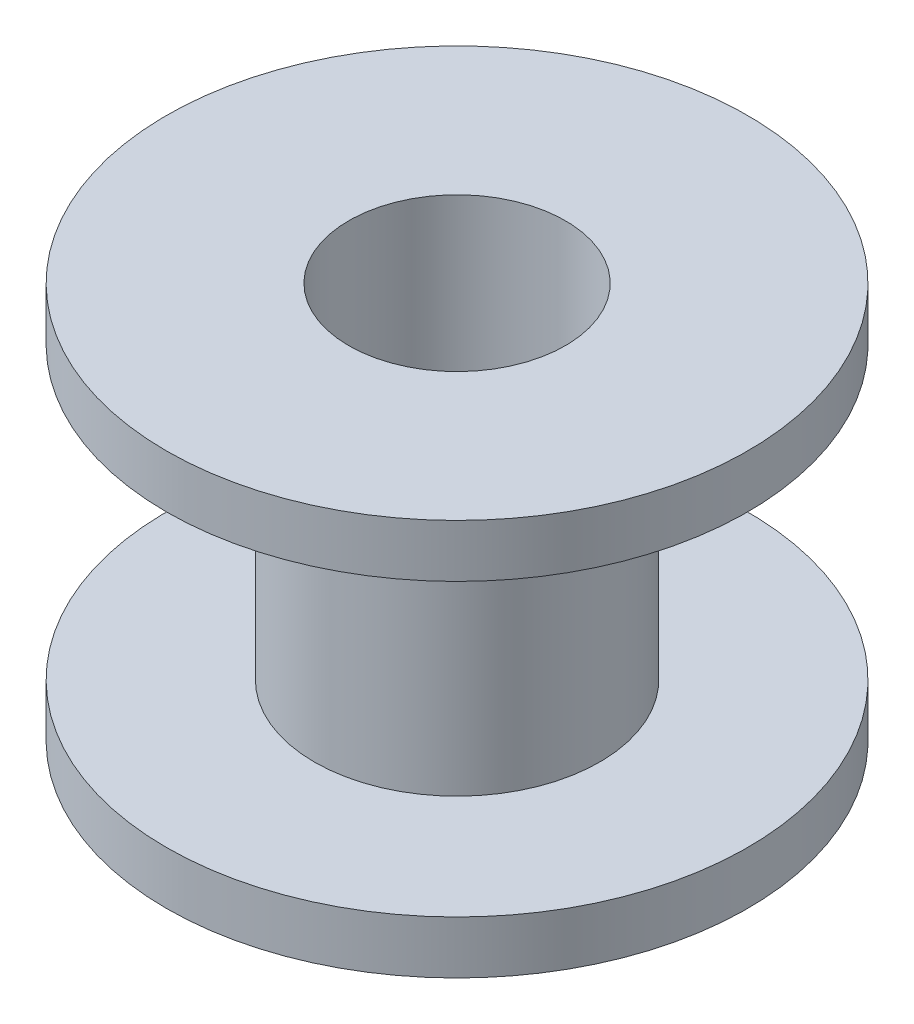
ISO-10303-21;
HEADER;
FILE_DESCRIPTION(('STEP AP214'),'2;1');
FILE_NAME('part.step','',(''),(''),'','','');
FILE_SCHEMA(('AUTOMOTIVE_DESIGN { 1 0 10303 214 1 1 1 1 }'));
ENDSEC;
DATA;
#1=APPLICATION_CONTEXT('core data for automotive mechanical design processes');
#2=APPLICATION_PROTOCOL_DEFINITION('international standard','automotive_design',2000,#1);
#3=PRODUCT_CONTEXT('',#1,'mechanical');
#4=PRODUCT('Part','Part','',(#3));
#5=PRODUCT_RELATED_PRODUCT_CATEGORY('part','',(#4));
#6=PRODUCT_DEFINITION_FORMATION('','',#4);
#7=PRODUCT_DEFINITION_CONTEXT('part definition',#1,'design');
#8=PRODUCT_DEFINITION('design','',#6,#7);
#9=PRODUCT_DEFINITION_SHAPE('','',#8);
#10=(LENGTH_UNIT() NAMED_UNIT(*) SI_UNIT(.MILLI.,.METRE.));
#11=(NAMED_UNIT(*) PLANE_ANGLE_UNIT() SI_UNIT($,.RADIAN.));
#12=(NAMED_UNIT(*) SI_UNIT($,.STERADIAN.) SOLID_ANGLE_UNIT());
#13=UNCERTAINTY_MEASURE_WITH_UNIT(LENGTH_MEASURE(1.E-05),#10,'distance_accuracy_value','');
#14=(GEOMETRIC_REPRESENTATION_CONTEXT(3) GLOBAL_UNCERTAINTY_ASSIGNED_CONTEXT((#13)) GLOBAL_UNIT_ASSIGNED_CONTEXT((#10,
#11,#12)) REPRESENTATION_CONTEXT('',''));
#15=CARTESIAN_POINT('',(0.,0.,0.));
#16=DIRECTION('',(0.,0.,1.));
#17=DIRECTION('',(1.,0.,0.));
#18=AXIS2_PLACEMENT_3D('',#15,#16,#17);
#19=CARTESIAN_POINT('',(0.,-5.5,5.39999999999999));
#20=DIRECTION('',(0.,1.,0.));
#21=DIRECTION('',(0.,0.,1.));
#22=AXIS2_PLACEMENT_3D('',#19,#20,#21);
#23=PLANE('',#22);
#24=CARTESIAN_POINT('',(0.,-5.5,0.));
#25=DIRECTION('',(0.,1.,0.));
#26=DIRECTION('',(0.,0.,1.));
#27=AXIS2_PLACEMENT_3D('',#24,#25,#26);
#28=CIRCLE('',#27,11.);
#29=CARTESIAN_POINT('',(0.,-5.5,11.));
#30=VERTEX_POINT('',#29);
#31=EDGE_CURVE('E10',#30,#30,#28,.T.);
#32=ORIENTED_EDGE('',*,*,#31,.T.);
#33=EDGE_LOOP('',(#32));
#34=FACE_BOUND('',#33,.T.);
#35=CARTESIAN_POINT('',(0.,-5.5,0.));
#36=DIRECTION('',(0.,1.,0.));
#37=DIRECTION('',(0.,0.,1.));
#38=AXIS2_PLACEMENT_3D('',#35,#36,#37);
#39=CIRCLE('',#38,5.39999999999999);
#40=CARTESIAN_POINT('',(0.,-5.5,5.39999999999999));
#41=VERTEX_POINT('',#40);
#42=EDGE_CURVE('E59',#41,#41,#39,.T.);
#43=ORIENTED_EDGE('',*,*,#42,.F.);
#44=EDGE_LOOP('',(#43));
#45=FACE_BOUND('',#44,.T.);
#46=ADVANCED_FACE('F31',(#34,#45),#23,.T.);
#47=CARTESIAN_POINT('',(0.,44.6590909090909,0.));
#48=DIRECTION('',(0.,1.,0.));
#49=DIRECTION('',(0.,0.,1.));
#50=AXIS2_PLACEMENT_3D('',#47,#48,#49);
#51=CYLINDRICAL_SURFACE('',#50,11.);
#52=CARTESIAN_POINT('',(0.,-7.5,0.));
#53=DIRECTION('',(0.,1.,0.));
#54=DIRECTION('',(0.,0.,1.));
#55=AXIS2_PLACEMENT_3D('',#52,#53,#54);
#56=CIRCLE('',#55,11.);
#57=CARTESIAN_POINT('',(0.,-7.5,11.));
#58=VERTEX_POINT('',#57);
#59=EDGE_CURVE('E37',#58,#58,#56,.T.);
#60=ORIENTED_EDGE('',*,*,#59,.T.);
#61=EDGE_LOOP('',(#60));
#62=FACE_BOUND('',#61,.T.);
#63=ORIENTED_EDGE('',*,*,#31,.F.);
#64=EDGE_LOOP('',(#63));
#65=FACE_BOUND('',#64,.T.);
#66=ADVANCED_FACE('F67',(#62,#65),#51,.T.);
#67=CARTESIAN_POINT('',(0.,-7.5,11.));
#68=DIRECTION('',(0.,-1.,0.));
#69=DIRECTION('',(0.,0.,-1.));
#70=AXIS2_PLACEMENT_3D('',#67,#68,#69);
#71=PLANE('',#70);
#72=CARTESIAN_POINT('',(0.,-7.5,0.));
#73=DIRECTION('',(0.,1.,0.));
#74=DIRECTION('',(0.,0.,1.));
#75=AXIS2_PLACEMENT_3D('',#72,#73,#74);
#76=CIRCLE('',#75,4.09999999999999);
#77=CARTESIAN_POINT('',(0.,-7.5,4.09999999999999));
#78=VERTEX_POINT('',#77);
#79=EDGE_CURVE('E41',#78,#78,#76,.T.);
#80=ORIENTED_EDGE('',*,*,#79,.T.);
#81=EDGE_LOOP('',(#80));
#82=FACE_BOUND('',#81,.T.);
#83=ORIENTED_EDGE('',*,*,#59,.F.);
#84=EDGE_LOOP('',(#83));
#85=FACE_BOUND('',#84,.T.);
#86=ADVANCED_FACE('F71',(#82,#85),#71,.T.);
#87=CARTESIAN_POINT('',(0.,44.6590909090909,0.));
#88=DIRECTION('',(0.,1.,0.));
#89=DIRECTION('',(0.,0.,1.));
#90=AXIS2_PLACEMENT_3D('',#87,#88,#89);
#91=CYLINDRICAL_SURFACE('',#90,4.09999999999999);
#92=CARTESIAN_POINT('',(0.,7.5,0.));
#93=DIRECTION('',(0.,1.,0.));
#94=DIRECTION('',(0.,0.,1.));
#95=AXIS2_PLACEMENT_3D('',#92,#93,#94);
#96=CIRCLE('',#95,4.09999999999999);
#97=CARTESIAN_POINT('',(0.,7.5,4.09999999999999));
#98=VERTEX_POINT('',#97);
#99=EDGE_CURVE('E45',#98,#98,#96,.T.);
#100=ORIENTED_EDGE('',*,*,#99,.T.);
#101=EDGE_LOOP('',(#100));
#102=FACE_BOUND('',#101,.T.);
#103=ORIENTED_EDGE('',*,*,#79,.F.);
#104=EDGE_LOOP('',(#103));
#105=FACE_BOUND('',#104,.T.);
#106=ADVANCED_FACE('F75',(#102,#105),#91,.F.);
#107=CARTESIAN_POINT('',(0.,7.5,11.));
#108=DIRECTION('',(0.,1.,0.));
#109=DIRECTION('',(0.,0.,1.));
#110=AXIS2_PLACEMENT_3D('',#107,#108,#109);
#111=PLANE('',#110);
#112=CARTESIAN_POINT('',(0.,7.5,0.));
#113=DIRECTION('',(0.,1.,0.));
#114=DIRECTION('',(0.,0.,1.));
#115=AXIS2_PLACEMENT_3D('',#112,#113,#114);
#116=CIRCLE('',#115,11.);
#117=CARTESIAN_POINT('',(0.,7.5,11.));
#118=VERTEX_POINT('',#117);
#119=EDGE_CURVE('E50',#118,#118,#116,.T.);
#120=ORIENTED_EDGE('',*,*,#119,.T.);
#121=EDGE_LOOP('',(#120));
#122=FACE_BOUND('',#121,.T.);
#123=ORIENTED_EDGE('',*,*,#99,.F.);
#124=EDGE_LOOP('',(#123));
#125=FACE_BOUND('',#124,.T.);
#126=ADVANCED_FACE('F82',(#122,#125),#111,.T.);
#127=CARTESIAN_POINT('',(0.,44.6590909090909,0.));
#128=DIRECTION('',(0.,1.,0.));
#129=DIRECTION('',(0.,0.,1.));
#130=AXIS2_PLACEMENT_3D('',#127,#128,#129);
#131=CYLINDRICAL_SURFACE('',#130,11.);
#132=CARTESIAN_POINT('',(0.,5.5,0.));
#133=DIRECTION('',(0.,1.,0.));
#134=DIRECTION('',(0.,0.,1.));
#135=AXIS2_PLACEMENT_3D('',#132,#133,#134);
#136=CIRCLE('',#135,11.);
#137=CARTESIAN_POINT('',(0.,5.5,11.));
#138=VERTEX_POINT('',#137);
#139=EDGE_CURVE('E53',#138,#138,#136,.T.);
#140=ORIENTED_EDGE('',*,*,#139,.T.);
#141=EDGE_LOOP('',(#140));
#142=FACE_BOUND('',#141,.T.);
#143=ORIENTED_EDGE('',*,*,#119,.F.);
#144=EDGE_LOOP('',(#143));
#145=FACE_BOUND('',#144,.T.);
#146=ADVANCED_FACE('F86',(#142,#145),#131,.T.);
#147=CARTESIAN_POINT('',(0.,5.5,5.39999999999999));
#148=DIRECTION('',(0.,-1.,0.));
#149=DIRECTION('',(0.,0.,-1.));
#150=AXIS2_PLACEMENT_3D('',#147,#148,#149);
#151=PLANE('',#150);
#152=CARTESIAN_POINT('',(0.,5.5,0.));
#153=DIRECTION('',(0.,1.,0.));
#154=DIRECTION('',(0.,0.,1.));
#155=AXIS2_PLACEMENT_3D('',#152,#153,#154);
#156=CIRCLE('',#155,5.39999999999999);
#157=CARTESIAN_POINT('',(0.,5.5,5.39999999999999));
#158=VERTEX_POINT('',#157);
#159=EDGE_CURVE('E56',#158,#158,#156,.T.);
#160=ORIENTED_EDGE('',*,*,#159,.T.);
#161=EDGE_LOOP('',(#160));
#162=FACE_BOUND('',#161,.T.);
#163=ORIENTED_EDGE('',*,*,#139,.F.);
#164=EDGE_LOOP('',(#163));
#165=FACE_BOUND('',#164,.T.);
#166=ADVANCED_FACE('F90',(#162,#165),#151,.T.);
#167=CARTESIAN_POINT('',(0.,44.6590909090909,0.));
#168=DIRECTION('',(0.,1.,0.));
#169=DIRECTION('',(0.,0.,1.));
#170=AXIS2_PLACEMENT_3D('',#167,#168,#169);
#171=CYLINDRICAL_SURFACE('',#170,5.39999999999999);
#172=ORIENTED_EDGE('',*,*,#42,.T.);
#173=EDGE_LOOP('',(#172));
#174=FACE_BOUND('',#173,.T.);
#175=ORIENTED_EDGE('',*,*,#159,.F.);
#176=EDGE_LOOP('',(#175));
#177=FACE_BOUND('',#176,.T.);
#178=ADVANCED_FACE('F63',(#174,#177),#171,.T.);
#179=CLOSED_SHELL('',(#46,#66,#86,#106,#126,#146,#166,#178));
#180=MANIFOLD_SOLID_BREP('B2',#179);
#181=ADVANCED_BREP_SHAPE_REPRESENTATION('',(#18,#180),#14);
#182=SHAPE_DEFINITION_REPRESENTATION(#9,#181);
ENDSEC;
END-ISO-10303-21;
